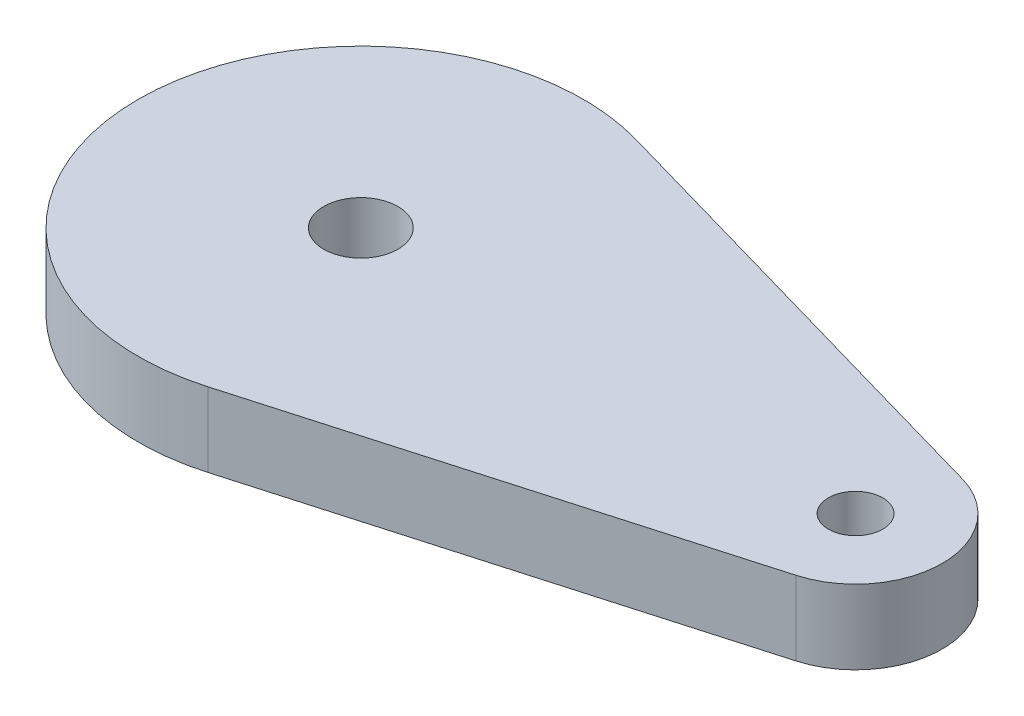
ISO-10303-21;
HEADER;
FILE_DESCRIPTION(('STEP AP214'),'2;1');
FILE_NAME('part.step','',(''),(''),'','','');
FILE_SCHEMA(('AUTOMOTIVE_DESIGN { 1 0 10303 214 1 1 1 1 }'));
ENDSEC;
DATA;
#1=APPLICATION_CONTEXT('core data for automotive mechanical design processes');
#2=APPLICATION_PROTOCOL_DEFINITION('international standard','automotive_design',2000,#1);
#3=PRODUCT_CONTEXT('',#1,'mechanical');
#4=PRODUCT('Part','Part','',(#3));
#5=PRODUCT_RELATED_PRODUCT_CATEGORY('part','',(#4));
#6=PRODUCT_DEFINITION_FORMATION('','',#4);
#7=PRODUCT_DEFINITION_CONTEXT('part definition',#1,'design');
#8=PRODUCT_DEFINITION('design','',#6,#7);
#9=PRODUCT_DEFINITION_SHAPE('','',#8);
#10=(LENGTH_UNIT() NAMED_UNIT(*) SI_UNIT(.MILLI.,.METRE.));
#11=(NAMED_UNIT(*) PLANE_ANGLE_UNIT() SI_UNIT($,.RADIAN.));
#12=(NAMED_UNIT(*) SI_UNIT($,.STERADIAN.) SOLID_ANGLE_UNIT());
#13=UNCERTAINTY_MEASURE_WITH_UNIT(LENGTH_MEASURE(1.E-05),#10,'distance_accuracy_value','');
#14=(GEOMETRIC_REPRESENTATION_CONTEXT(3) GLOBAL_UNCERTAINTY_ASSIGNED_CONTEXT((#13)) GLOBAL_UNIT_ASSIGNED_CONTEXT((#10,
#11,#12)) REPRESENTATION_CONTEXT('',''));
#15=CARTESIAN_POINT('',(0.,0.,0.));
#16=DIRECTION('',(0.,0.,1.));
#17=DIRECTION('',(1.,0.,0.));
#18=AXIS2_PLACEMENT_3D('',#15,#16,#17);
#19=CARTESIAN_POINT('',(0.,3.,0.));
#20=DIRECTION('',(0.,-1.,0.));
#21=DIRECTION('',(0.,0.,-1.));
#22=AXIS2_PLACEMENT_3D('',#19,#20,#21);
#23=CYLINDRICAL_SURFACE('',#22,9.);
#24=CARTESIAN_POINT('',(0.,0.,0.));
#25=DIRECTION('',(0.,1.,0.));
#26=DIRECTION('',(0.,0.,1.));
#27=AXIS2_PLACEMENT_3D('',#24,#25,#26);
#28=CIRCLE('',#27,9.);
#29=CARTESIAN_POINT('',(2.475,0.,-8.65299803536323));
#30=VERTEX_POINT('',#29);
#31=CARTESIAN_POINT('',(2.475,0.,8.65299803536323));
#32=VERTEX_POINT('',#31);
#33=EDGE_CURVE('E98',#30,#32,#28,.T.);
#34=ORIENTED_EDGE('',*,*,#33,.T.);
#35=DIRECTION('',(0.,-1.,0.));
#36=VECTOR('',#35,1.);
#37=CARTESIAN_POINT('',(2.475,3.,8.65299803536323));
#38=LINE('',#37,#36);
#39=CARTESIAN_POINT('',(2.475,3.,8.65299803536323));
#40=VERTEX_POINT('',#39);
#41=EDGE_CURVE('E11',#40,#32,#38,.T.);
#42=ORIENTED_EDGE('',*,*,#41,.F.);
#43=CARTESIAN_POINT('',(0.,3.,0.));
#44=DIRECTION('',(0.,1.,0.));
#45=DIRECTION('',(0.,0.,1.));
#46=AXIS2_PLACEMENT_3D('',#43,#44,#45);
#47=CIRCLE('',#46,9.);
#48=CARTESIAN_POINT('',(2.475,3.,-8.65299803536323));
#49=VERTEX_POINT('',#48);
#50=EDGE_CURVE('E86',#49,#40,#47,.T.);
#51=ORIENTED_EDGE('',*,*,#50,.F.);
#52=DIRECTION('',(0.,-1.,0.));
#53=VECTOR('',#52,1.);
#54=CARTESIAN_POINT('',(2.475,3.,-8.65299803536323));
#55=LINE('',#54,#53);
#56=EDGE_CURVE('E94',#49,#30,#55,.T.);
#57=ORIENTED_EDGE('',*,*,#56,.T.);
#58=EDGE_LOOP('',(#34,#42,#51,#57));
#59=FACE_BOUND('',#58,.T.);
#60=ADVANCED_FACE('F35',(#59),#23,.T.);
#61=CARTESIAN_POINT('',(20.9625,3.,3.36505479153014));
#62=DIRECTION('',(-0.275,0.,-0.961444226151471));
#63=DIRECTION('',(-0.961444226151471,0.,0.275));
#64=AXIS2_PLACEMENT_3D('',#61,#62,#63);
#65=PLANE('',#64);
#66=DIRECTION('',(0.961444226151471,0.,-0.275));
#67=VECTOR('',#66,1.);
#68=CARTESIAN_POINT('',(20.9625,0.,3.36505479153014));
#69=LINE('',#68,#67);
#70=CARTESIAN_POINT('',(20.9625,0.,3.36505479153014));
#71=VERTEX_POINT('',#70);
#72=EDGE_CURVE('E90',#32,#71,#69,.T.);
#73=ORIENTED_EDGE('',*,*,#72,.T.);
#74=DIRECTION('',(0.,-1.,0.));
#75=VECTOR('',#74,1.);
#76=CARTESIAN_POINT('',(20.9625,3.,3.36505479153014));
#77=LINE('',#76,#75);
#78=CARTESIAN_POINT('',(20.9625,3.,3.36505479153014));
#79=VERTEX_POINT('',#78);
#80=EDGE_CURVE('E43',#79,#71,#77,.T.);
#81=ORIENTED_EDGE('',*,*,#80,.F.);
#82=DIRECTION('',(0.961444226151471,0.,-0.275));
#83=VECTOR('',#82,1.);
#84=CARTESIAN_POINT('',(20.9625,3.,3.36505479153014));
#85=LINE('',#84,#83);
#86=EDGE_CURVE('E81',#40,#79,#85,.T.);
#87=ORIENTED_EDGE('',*,*,#86,.F.);
#88=ORIENTED_EDGE('',*,*,#41,.T.);
#89=EDGE_LOOP('',(#73,#81,#87,#88));
#90=FACE_BOUND('',#89,.T.);
#91=ADVANCED_FACE('F89',(#90),#65,.F.);
#92=CARTESIAN_POINT('',(20.,3.,0.));
#93=DIRECTION('',(0.,-1.,0.));
#94=DIRECTION('',(0.,0.,-1.));
#95=AXIS2_PLACEMENT_3D('',#92,#93,#94);
#96=CYLINDRICAL_SURFACE('',#95,3.5);
#97=CARTESIAN_POINT('',(20.,0.,0.));
#98=DIRECTION('',(0.,1.,0.));
#99=DIRECTION('',(0.,0.,1.));
#100=AXIS2_PLACEMENT_3D('',#97,#98,#99);
#101=CIRCLE('',#100,3.5);
#102=CARTESIAN_POINT('',(20.9625,0.,-3.36505479153015));
#103=VERTEX_POINT('',#102);
#104=EDGE_CURVE('E68',#71,#103,#101,.T.);
#105=ORIENTED_EDGE('',*,*,#104,.T.);
#106=DIRECTION('',(0.,-1.,0.));
#107=VECTOR('',#106,1.);
#108=CARTESIAN_POINT('',(20.9625,3.,-3.36505479153015));
#109=LINE('',#108,#107);
#110=CARTESIAN_POINT('',(20.9625,3.,-3.36505479153015));
#111=VERTEX_POINT('',#110);
#112=EDGE_CURVE('E91',#111,#103,#109,.T.);
#113=ORIENTED_EDGE('',*,*,#112,.F.);
#114=CARTESIAN_POINT('',(20.,3.,0.));
#115=DIRECTION('',(0.,1.,0.));
#116=DIRECTION('',(0.,0.,1.));
#117=AXIS2_PLACEMENT_3D('',#114,#115,#116);
#118=CIRCLE('',#117,3.5);
#119=EDGE_CURVE('E84',#79,#111,#118,.T.);
#120=ORIENTED_EDGE('',*,*,#119,.F.);
#121=ORIENTED_EDGE('',*,*,#80,.T.);
#122=EDGE_LOOP('',(#105,#113,#120,#121));
#123=FACE_BOUND('',#122,.T.);
#124=ADVANCED_FACE('F92',(#123),#96,.T.);
#125=CARTESIAN_POINT('',(2.475,3.,-8.65299803536323));
#126=DIRECTION('',(-0.275,0.,0.961444226151471));
#127=DIRECTION('',(0.961444226151471,0.,0.275));
#128=AXIS2_PLACEMENT_3D('',#125,#126,#127);
#129=PLANE('',#128);
#130=DIRECTION('',(-0.961444226151471,0.,-0.275));
#131=VECTOR('',#130,1.);
#132=CARTESIAN_POINT('',(2.475,0.,-8.65299803536323));
#133=LINE('',#132,#131);
#134=EDGE_CURVE('E74',#103,#30,#133,.T.);
#135=ORIENTED_EDGE('',*,*,#134,.T.);
#136=ORIENTED_EDGE('',*,*,#56,.F.);
#137=DIRECTION('',(-0.961444226151471,0.,-0.275));
#138=VECTOR('',#137,1.);
#139=CARTESIAN_POINT('',(2.475,3.,-8.65299803536323));
#140=LINE('',#139,#138);
#141=EDGE_CURVE('E51',#111,#49,#140,.T.);
#142=ORIENTED_EDGE('',*,*,#141,.F.);
#143=ORIENTED_EDGE('',*,*,#112,.T.);
#144=EDGE_LOOP('',(#135,#136,#142,#143));
#145=FACE_BOUND('',#144,.T.);
#146=ADVANCED_FACE('F106',(#145),#129,.F.);
#147=CARTESIAN_POINT('',(0.,3.,0.));
#148=DIRECTION('',(0.,1.,0.));
#149=DIRECTION('',(0.,0.,1.));
#150=AXIS2_PLACEMENT_3D('',#147,#148,#149);
#151=PLANE('',#150);
#152=CARTESIAN_POINT('',(20.,3.,0.));
#153=DIRECTION('',(0.,1.,0.));
#154=DIRECTION('',(0.,0.,1.));
#155=AXIS2_PLACEMENT_3D('',#152,#153,#154);
#156=CIRCLE('',#155,1.1);
#157=CARTESIAN_POINT('',(20.,3.,1.1));
#158=VERTEX_POINT('',#157);
#159=EDGE_CURVE('E118',#158,#158,#156,.T.);
#160=ORIENTED_EDGE('',*,*,#159,.F.);
#161=EDGE_LOOP('',(#160));
#162=FACE_BOUND('',#161,.T.);
#163=CARTESIAN_POINT('',(0.,3.,0.));
#164=DIRECTION('',(0.,1.,0.));
#165=DIRECTION('',(0.,0.,1.));
#166=AXIS2_PLACEMENT_3D('',#163,#164,#165);
#167=CIRCLE('',#166,1.5);
#168=CARTESIAN_POINT('',(0.,3.,1.5));
#169=VERTEX_POINT('',#168);
#170=EDGE_CURVE('E112',#169,#169,#167,.T.);
#171=ORIENTED_EDGE('',*,*,#170,.F.);
#172=EDGE_LOOP('',(#171));
#173=FACE_BOUND('',#172,.T.);
#174=ORIENTED_EDGE('',*,*,#50,.T.);
#175=ORIENTED_EDGE('',*,*,#86,.T.);
#176=ORIENTED_EDGE('',*,*,#119,.T.);
#177=ORIENTED_EDGE('',*,*,#141,.T.);
#178=EDGE_LOOP('',(#174,#175,#176,#177));
#179=FACE_BOUND('',#178,.T.);
#180=ADVANCED_FACE('F82',(#162,#173,#179),#151,.T.);
#181=CARTESIAN_POINT('',(0.,0.,0.));
#182=DIRECTION('',(0.,1.,0.));
#183=DIRECTION('',(0.,0.,1.));
#184=AXIS2_PLACEMENT_3D('',#181,#182,#183);
#185=PLANE('',#184);
#186=CARTESIAN_POINT('',(20.,0.,0.));
#187=DIRECTION('',(0.,1.,0.));
#188=DIRECTION('',(0.,0.,1.));
#189=AXIS2_PLACEMENT_3D('',#186,#187,#188);
#190=CIRCLE('',#189,1.1);
#191=CARTESIAN_POINT('',(20.,0.,1.1));
#192=VERTEX_POINT('',#191);
#193=EDGE_CURVE('E115',#192,#192,#190,.T.);
#194=ORIENTED_EDGE('',*,*,#193,.T.);
#195=EDGE_LOOP('',(#194));
#196=FACE_BOUND('',#195,.T.);
#197=CARTESIAN_POINT('',(0.,0.,0.));
#198=DIRECTION('',(0.,1.,0.));
#199=DIRECTION('',(0.,0.,1.));
#200=AXIS2_PLACEMENT_3D('',#197,#198,#199);
#201=CIRCLE('',#200,1.5);
#202=CARTESIAN_POINT('',(0.,0.,1.5));
#203=VERTEX_POINT('',#202);
#204=EDGE_CURVE('E101',#203,#203,#201,.T.);
#205=ORIENTED_EDGE('',*,*,#204,.T.);
#206=EDGE_LOOP('',(#205));
#207=FACE_BOUND('',#206,.T.);
#208=ORIENTED_EDGE('',*,*,#33,.F.);
#209=ORIENTED_EDGE('',*,*,#134,.F.);
#210=ORIENTED_EDGE('',*,*,#104,.F.);
#211=ORIENTED_EDGE('',*,*,#72,.F.);
#212=EDGE_LOOP('',(#208,#209,#210,#211));
#213=FACE_BOUND('',#212,.T.);
#214=ADVANCED_FACE('F109',(#196,#207,#213),#185,.F.);
#215=CARTESIAN_POINT('',(0.,0.,0.));
#216=DIRECTION('',(0.,1.,0.));
#217=DIRECTION('',(0.,0.,1.));
#218=AXIS2_PLACEMENT_3D('',#215,#216,#217);
#219=CYLINDRICAL_SURFACE('',#218,1.5);
#220=ORIENTED_EDGE('',*,*,#204,.F.);
#221=EDGE_LOOP('',(#220));
#222=FACE_BOUND('',#221,.T.);
#223=ORIENTED_EDGE('',*,*,#170,.T.);
#224=EDGE_LOOP('',(#223));
#225=FACE_BOUND('',#224,.T.);
#226=ADVANCED_FACE('F129',(#222,#225),#219,.F.);
#227=CARTESIAN_POINT('',(20.,0.,0.));
#228=DIRECTION('',(0.,1.,0.));
#229=DIRECTION('',(0.,0.,1.));
#230=AXIS2_PLACEMENT_3D('',#227,#228,#229);
#231=CYLINDRICAL_SURFACE('',#230,1.1);
#232=ORIENTED_EDGE('',*,*,#193,.F.);
#233=EDGE_LOOP('',(#232));
#234=FACE_BOUND('',#233,.T.);
#235=ORIENTED_EDGE('',*,*,#159,.T.);
#236=EDGE_LOOP('',(#235));
#237=FACE_BOUND('',#236,.T.);
#238=ADVANCED_FACE('F126',(#234,#237),#231,.F.);
#239=CLOSED_SHELL('',(#60,#91,#124,#146,#180,#214,#226,#238));
#240=MANIFOLD_SOLID_BREP('B2',#239);
#241=ADVANCED_BREP_SHAPE_REPRESENTATION('',(#18,#240),#14);
#242=SHAPE_DEFINITION_REPRESENTATION(#9,#241);
ENDSEC;
END-ISO-10303-21;
